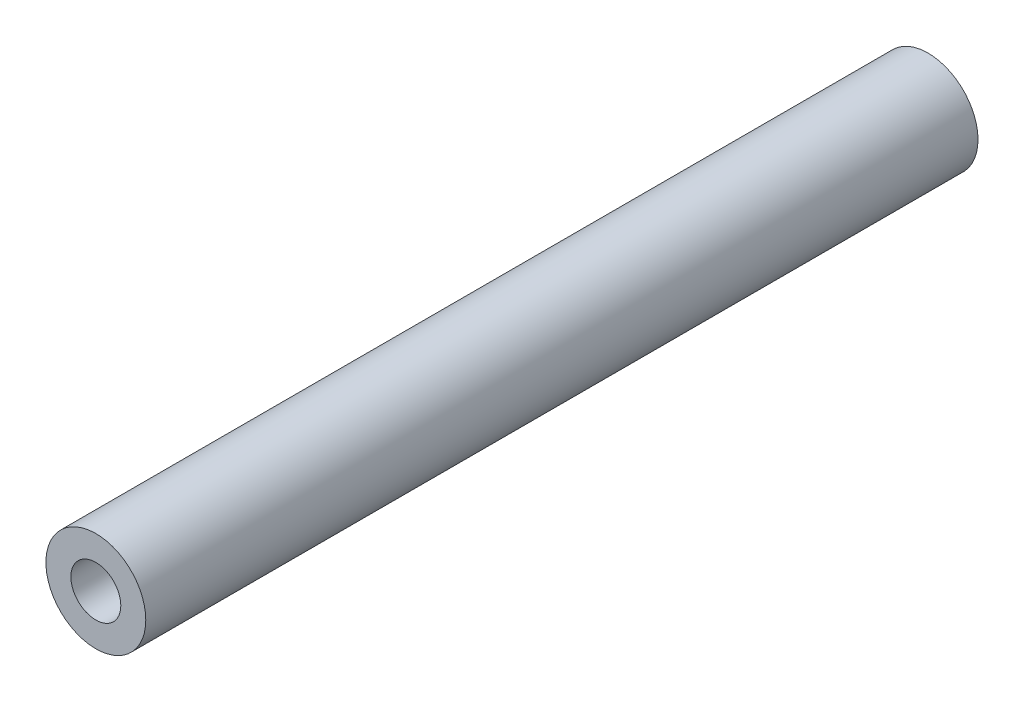
ISO-10303-21;
HEADER;
FILE_DESCRIPTION(('STEP AP214'),'2;1');
FILE_NAME('part.step','',(''),(''),'','','');
FILE_SCHEMA(('AUTOMOTIVE_DESIGN { 1 0 10303 214 1 1 1 1 }'));
ENDSEC;
DATA;
#1=APPLICATION_CONTEXT('core data for automotive mechanical design processes');
#2=APPLICATION_PROTOCOL_DEFINITION('international standard','automotive_design',2000,#1);
#3=PRODUCT_CONTEXT('',#1,'mechanical');
#4=PRODUCT('Part','Part','',(#3));
#5=PRODUCT_RELATED_PRODUCT_CATEGORY('part','',(#4));
#6=PRODUCT_DEFINITION_FORMATION('','',#4);
#7=PRODUCT_DEFINITION_CONTEXT('part definition',#1,'design');
#8=PRODUCT_DEFINITION('design','',#6,#7);
#9=PRODUCT_DEFINITION_SHAPE('','',#8);
#10=(LENGTH_UNIT() NAMED_UNIT(*) SI_UNIT(.MILLI.,.METRE.));
#11=(NAMED_UNIT(*) PLANE_ANGLE_UNIT() SI_UNIT($,.RADIAN.));
#12=(NAMED_UNIT(*) SI_UNIT($,.STERADIAN.) SOLID_ANGLE_UNIT());
#13=UNCERTAINTY_MEASURE_WITH_UNIT(LENGTH_MEASURE(1.E-05),#10,'distance_accuracy_value','');
#14=(GEOMETRIC_REPRESENTATION_CONTEXT(3) GLOBAL_UNCERTAINTY_ASSIGNED_CONTEXT((#13)) GLOBAL_UNIT_ASSIGNED_CONTEXT((#10,
#11,#12)) REPRESENTATION_CONTEXT('',''));
#15=CARTESIAN_POINT('',(0.,0.,0.));
#16=DIRECTION('',(0.,0.,1.));
#17=DIRECTION('',(1.,0.,0.));
#18=AXIS2_PLACEMENT_3D('',#15,#16,#17);
#19=CARTESIAN_POINT('',(0.,0.,100.));
#20=DIRECTION('',(0.,0.,1.));
#21=DIRECTION('',(1.,0.,0.));
#22=AXIS2_PLACEMENT_3D('',#19,#20,#21);
#23=PLANE('',#22);
#24=CARTESIAN_POINT('',(0.,0.,100.));
#25=DIRECTION('',(0.,0.,1.));
#26=DIRECTION('',(1.,0.,0.));
#27=AXIS2_PLACEMENT_3D('',#24,#25,#26);
#28=CIRCLE('',#27,6.);
#29=CARTESIAN_POINT('',(6.,0.,100.));
#30=VERTEX_POINT('',#29);
#31=EDGE_CURVE('E10',#30,#30,#28,.T.);
#32=ORIENTED_EDGE('',*,*,#31,.T.);
#33=EDGE_LOOP('',(#32));
#34=FACE_BOUND('',#33,.T.);
#35=CARTESIAN_POINT('',(0.,0.,100.));
#36=DIRECTION('',(0.,0.,1.));
#37=DIRECTION('',(1.,0.,0.));
#38=AXIS2_PLACEMENT_3D('',#35,#36,#37);
#39=CIRCLE('',#38,3.);
#40=CARTESIAN_POINT('',(3.,0.,100.));
#41=VERTEX_POINT('',#40);
#42=EDGE_CURVE('E41',#41,#41,#39,.T.);
#43=ORIENTED_EDGE('',*,*,#42,.F.);
#44=EDGE_LOOP('',(#43));
#45=FACE_BOUND('',#44,.T.);
#46=ADVANCED_FACE('F30',(#34,#45),#23,.T.);
#47=CARTESIAN_POINT('',(0.,0.,0.));
#48=DIRECTION('',(0.,0.,1.));
#49=DIRECTION('',(1.,0.,0.));
#50=AXIS2_PLACEMENT_3D('',#47,#48,#49);
#51=PLANE('',#50);
#52=CARTESIAN_POINT('',(0.,0.,0.));
#53=DIRECTION('',(0.,0.,1.));
#54=DIRECTION('',(1.,0.,0.));
#55=AXIS2_PLACEMENT_3D('',#52,#53,#54);
#56=CIRCLE('',#55,6.);
#57=CARTESIAN_POINT('',(6.,0.,0.));
#58=VERTEX_POINT('',#57);
#59=EDGE_CURVE('E34',#58,#58,#56,.T.);
#60=ORIENTED_EDGE('',*,*,#59,.F.);
#61=EDGE_LOOP('',(#60));
#62=FACE_BOUND('',#61,.T.);
#63=CARTESIAN_POINT('',(0.,0.,0.));
#64=DIRECTION('',(0.,0.,1.));
#65=DIRECTION('',(1.,0.,0.));
#66=AXIS2_PLACEMENT_3D('',#63,#64,#65);
#67=CIRCLE('',#66,3.);
#68=CARTESIAN_POINT('',(3.,0.,0.));
#69=VERTEX_POINT('',#68);
#70=EDGE_CURVE('E43',#69,#69,#67,.T.);
#71=ORIENTED_EDGE('',*,*,#70,.T.);
#72=EDGE_LOOP('',(#71));
#73=FACE_BOUND('',#72,.T.);
#74=ADVANCED_FACE('F53',(#62,#73),#51,.F.);
#75=CARTESIAN_POINT('',(0.,0.,100.));
#76=DIRECTION('',(0.,0.,-1.));
#77=DIRECTION('',(-1.,0.,0.));
#78=AXIS2_PLACEMENT_3D('',#75,#76,#77);
#79=CYLINDRICAL_SURFACE('',#78,6.);
#80=ORIENTED_EDGE('',*,*,#31,.F.);
#81=EDGE_LOOP('',(#80));
#82=FACE_BOUND('',#81,.T.);
#83=ORIENTED_EDGE('',*,*,#59,.T.);
#84=EDGE_LOOP('',(#83));
#85=FACE_BOUND('',#84,.T.);
#86=ADVANCED_FACE('F32',(#82,#85),#79,.T.);
#87=CARTESIAN_POINT('',(0.,0.,100.));
#88=DIRECTION('',(0.,0.,-1.));
#89=DIRECTION('',(-1.,0.,0.));
#90=AXIS2_PLACEMENT_3D('',#87,#88,#89);
#91=CYLINDRICAL_SURFACE('',#90,3.);
#92=ORIENTED_EDGE('',*,*,#42,.T.);
#93=EDGE_LOOP('',(#92));
#94=FACE_BOUND('',#93,.T.);
#95=ORIENTED_EDGE('',*,*,#70,.F.);
#96=EDGE_LOOP('',(#95));
#97=FACE_BOUND('',#96,.T.);
#98=ADVANCED_FACE('F49',(#94,#97),#91,.F.);
#99=CLOSED_SHELL('',(#46,#74,#86,#98));
#100=MANIFOLD_SOLID_BREP('B2',#99);
#101=ADVANCED_BREP_SHAPE_REPRESENTATION('',(#18,#100),#14);
#102=SHAPE_DEFINITION_REPRESENTATION(#9,#101);
ENDSEC;
END-ISO-10303-21;
